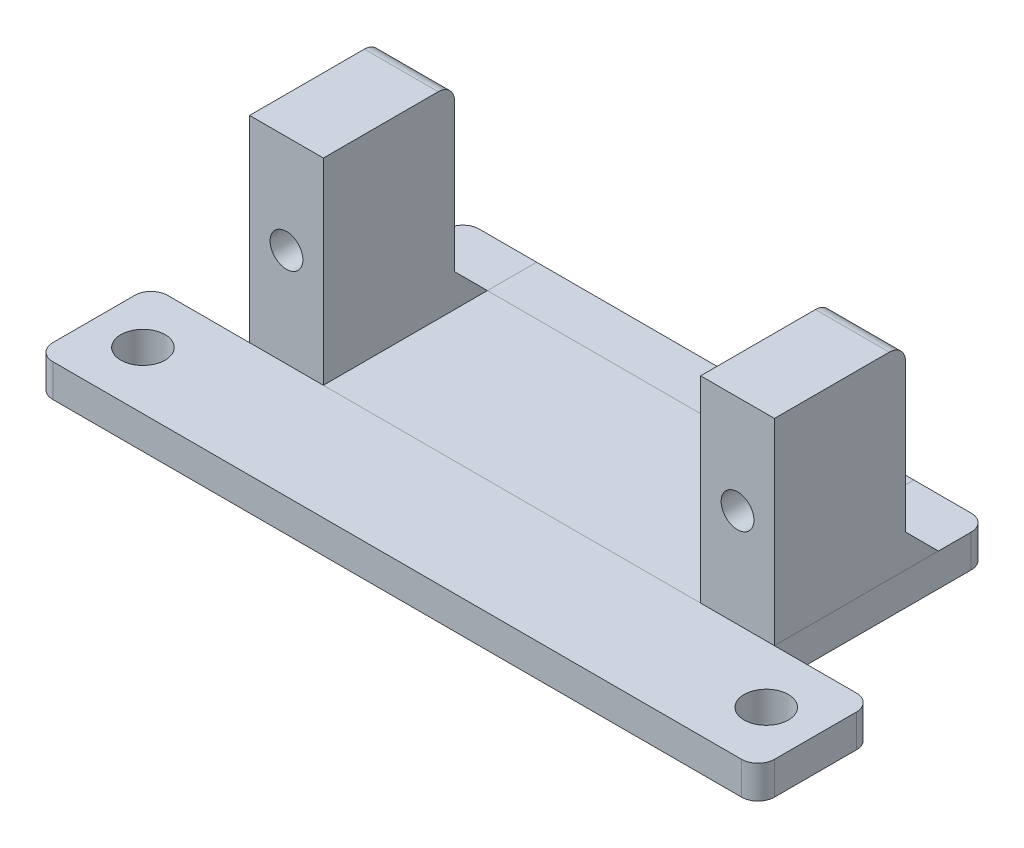
ISO-10303-21;
HEADER;
FILE_DESCRIPTION(('STEP AP214'),'2;1');
FILE_NAME('part.step','',(''),(''),'','','');
FILE_SCHEMA(('AUTOMOTIVE_DESIGN { 1 0 10303 214 1 1 1 1 }'));
ENDSEC;
DATA;
#1=APPLICATION_CONTEXT('core data for automotive mechanical design processes');
#2=APPLICATION_PROTOCOL_DEFINITION('international standard','automotive_design',2000,#1);
#3=PRODUCT_CONTEXT('',#1,'mechanical');
#4=PRODUCT('Part','Part','',(#3));
#5=PRODUCT_RELATED_PRODUCT_CATEGORY('part','',(#4));
#6=PRODUCT_DEFINITION_FORMATION('','',#4);
#7=PRODUCT_DEFINITION_CONTEXT('part definition',#1,'design');
#8=PRODUCT_DEFINITION('design','',#6,#7);
#9=PRODUCT_DEFINITION_SHAPE('','',#8);
#10=(LENGTH_UNIT() NAMED_UNIT(*) SI_UNIT(.MILLI.,.METRE.));
#11=(NAMED_UNIT(*) PLANE_ANGLE_UNIT() SI_UNIT($,.RADIAN.));
#12=(NAMED_UNIT(*) SI_UNIT($,.STERADIAN.) SOLID_ANGLE_UNIT());
#13=UNCERTAINTY_MEASURE_WITH_UNIT(LENGTH_MEASURE(1.E-05),#10,'distance_accuracy_value','');
#14=(GEOMETRIC_REPRESENTATION_CONTEXT(3) GLOBAL_UNCERTAINTY_ASSIGNED_CONTEXT((#13)) GLOBAL_UNIT_ASSIGNED_CONTEXT((#10,
#11,#12)) REPRESENTATION_CONTEXT('',''));
#15=CARTESIAN_POINT('',(0.,0.,0.));
#16=DIRECTION('',(0.,0.,1.));
#17=DIRECTION('',(1.,0.,0.));
#18=AXIS2_PLACEMENT_3D('',#15,#16,#17);
#19=CARTESIAN_POINT('',(-16.,0.,-13.));
#20=DIRECTION('',(-1.,0.,0.));
#21=DIRECTION('',(0.,0.,1.));
#22=AXIS2_PLACEMENT_3D('',#19,#20,#21);
#23=PLANE('',#22);
#24=DIRECTION('',(0.,0.,1.));
#25=VECTOR('',#24,1.);
#26=CARTESIAN_POINT('',(-16.,0.,-13.));
#27=LINE('',#26,#25);
#28=CARTESIAN_POINT('',(-16.,0.,-12.));
#29=VERTEX_POINT('',#28);
#30=CARTESIAN_POINT('',(-16.,0.,-10.));
#31=VERTEX_POINT('',#30);
#32=EDGE_CURVE('E18',#29,#31,#27,.T.);
#33=ORIENTED_EDGE('',*,*,#32,.F.);
#34=DIRECTION('',(0.,-1.,0.));
#35=VECTOR('',#34,1.);
#36=CARTESIAN_POINT('',(-16.,0.,-12.));
#37=LINE('',#36,#35);
#38=CARTESIAN_POINT('',(-16.,-2.,-12.));
#39=VERTEX_POINT('',#38);
#40=EDGE_CURVE('E9',#29,#39,#37,.T.);
#41=ORIENTED_EDGE('',*,*,#40,.T.);
#42=DIRECTION('',(0.,0.,1.));
#43=VECTOR('',#42,1.);
#44=CARTESIAN_POINT('',(-16.,-2.,-13.));
#45=LINE('',#44,#43);
#46=CARTESIAN_POINT('',(-16.,-2.,0.));
#47=VERTEX_POINT('',#46);
#48=EDGE_CURVE('E25',#39,#47,#45,.T.);
#49=ORIENTED_EDGE('',*,*,#48,.T.);
#50=DIRECTION('',(0.,-1.,0.));
#51=VECTOR('',#50,1.);
#52=CARTESIAN_POINT('',(-16.,0.,0.));
#53=LINE('',#52,#51);
#54=CARTESIAN_POINT('',(-16.,0.,0.));
#55=VERTEX_POINT('',#54);
#56=EDGE_CURVE('E409',#55,#47,#53,.T.);
#57=ORIENTED_EDGE('',*,*,#56,.F.);
#58=DIRECTION('',(0.,0.,1.));
#59=VECTOR('',#58,1.);
#60=CARTESIAN_POINT('',(-16.,0.,-13.));
#61=LINE('',#60,#59);
#62=EDGE_CURVE('E441',#31,#55,#61,.T.);
#63=ORIENTED_EDGE('',*,*,#62,.F.);
#64=EDGE_LOOP('',(#33,#41,#49,#57,#63));
#65=FACE_BOUND('',#64,.T.);
#66=ADVANCED_FACE('F14',(#65),#23,.T.);
#67=CARTESIAN_POINT('',(0.,0.,-1.78125));
#68=DIRECTION('',(0.,1.,0.));
#69=DIRECTION('',(0.,0.,-1.));
#70=AXIS2_PLACEMENT_3D('',#67,#68,#69);
#71=PLANE('',#70);
#72=DIRECTION('',(-1.,0.,0.));
#73=VECTOR('',#72,1.);
#74=CARTESIAN_POINT('',(16.,0.,-13.));
#75=LINE('',#74,#73);
#76=CARTESIAN_POINT('',(-11.5,0.,-13.));
#77=VERTEX_POINT('',#76);
#78=CARTESIAN_POINT('',(-15.,0.,-13.));
#79=VERTEX_POINT('',#78);
#80=EDGE_CURVE('E352',#77,#79,#75,.T.);
#81=ORIENTED_EDGE('',*,*,#80,.T.);
#82=CARTESIAN_POINT('',(-15.,0.,-12.));
#83=DIRECTION('',(0.,-1.,0.));
#84=DIRECTION('',(0.,0.,-1.));
#85=AXIS2_PLACEMENT_3D('',#82,#83,#84);
#86=CIRCLE('',#85,1.);
#87=EDGE_CURVE('E502',#29,#79,#86,.T.);
#88=ORIENTED_EDGE('',*,*,#87,.F.);
#89=ORIENTED_EDGE('',*,*,#32,.T.);
#90=DIRECTION('',(1.,0.,0.));
#91=VECTOR('',#90,1.);
#92=CARTESIAN_POINT('',(-16.,0.,-10.));
#93=LINE('',#92,#91);
#94=CARTESIAN_POINT('',(-11.5,0.,-10.));
#95=VERTEX_POINT('',#94);
#96=EDGE_CURVE('E526',#31,#95,#93,.T.);
#97=ORIENTED_EDGE('',*,*,#96,.T.);
#98=DIRECTION('',(0.,0.,-1.));
#99=VECTOR('',#98,1.);
#100=CARTESIAN_POINT('',(-11.5,0.,0.));
#101=LINE('',#100,#99);
#102=EDGE_CURVE('E530',#95,#77,#101,.T.);
#103=ORIENTED_EDGE('',*,*,#102,.T.);
#104=EDGE_LOOP('',(#81,#88,#89,#97,#103));
#105=FACE_BOUND('',#104,.T.);
#106=ADVANCED_FACE('F910',(#105),#71,.T.);
#107=CARTESIAN_POINT('',(-15.,0.,-12.));
#108=DIRECTION('',(0.,-1.,0.));
#109=DIRECTION('',(-1.,0.,0.));
#110=AXIS2_PLACEMENT_3D('',#107,#108,#109);
#111=CYLINDRICAL_SURFACE('',#110,1.);
#112=ORIENTED_EDGE('',*,*,#87,.T.);
#113=DIRECTION('',(0.,-1.,0.));
#114=VECTOR('',#113,1.);
#115=CARTESIAN_POINT('',(-15.,0.,-13.));
#116=LINE('',#115,#114);
#117=CARTESIAN_POINT('',(-15.,-2.,-13.));
#118=VERTEX_POINT('',#117);
#119=EDGE_CURVE('E356',#79,#118,#116,.T.);
#120=ORIENTED_EDGE('',*,*,#119,.T.);
#121=CARTESIAN_POINT('',(-15.,-2.,-12.));
#122=DIRECTION('',(0.,-1.,0.));
#123=DIRECTION('',(0.,0.,-1.));
#124=AXIS2_PLACEMENT_3D('',#121,#122,#123);
#125=CIRCLE('',#124,1.);
#126=EDGE_CURVE('E531',#39,#118,#125,.T.);
#127=ORIENTED_EDGE('',*,*,#126,.F.);
#128=ORIENTED_EDGE('',*,*,#40,.F.);
#129=EDGE_LOOP('',(#112,#120,#127,#128));
#130=FACE_BOUND('',#129,.T.);
#131=ADVANCED_FACE('F981',(#130),#111,.T.);
#132=CARTESIAN_POINT('',(-16.,5.62309763147,-4.37690236853));
#133=DIRECTION('',(-1.,0.,0.));
#134=DIRECTION('',(0.,0.,1.));
#135=AXIS2_PLACEMENT_3D('',#132,#133,#134);
#136=PLANE('',#135);
#137=DIRECTION('',(0.,0.,-1.));
#138=VECTOR('',#137,1.);
#139=CARTESIAN_POINT('',(-16.,12.,0.));
#140=LINE('',#139,#138);
#141=CARTESIAN_POINT('',(-16.,12.,0.));
#142=VERTEX_POINT('',#141);
#143=CARTESIAN_POINT('',(-16.,12.,-7.));
#144=VERTEX_POINT('',#143);
#145=EDGE_CURVE('E353',#142,#144,#140,.T.);
#146=ORIENTED_EDGE('',*,*,#145,.T.);
#147=CARTESIAN_POINT('',(-16.,11.,-7.));
#148=DIRECTION('',(-1.,0.,0.));
#149=DIRECTION('',(0.,0.,1.));
#150=AXIS2_PLACEMENT_3D('',#147,#148,#149);
#151=CIRCLE('',#150,1.);
#152=CARTESIAN_POINT('',(-16.,11.,-8.));
#153=VERTEX_POINT('',#152);
#154=EDGE_CURVE('E202',#144,#153,#151,.T.);
#155=ORIENTED_EDGE('',*,*,#154,.T.);
#156=DIRECTION('',(0.,-1.,0.));
#157=VECTOR('',#156,1.);
#158=CARTESIAN_POINT('',(-16.,12.,-8.));
#159=LINE('',#158,#157);
#160=CARTESIAN_POINT('',(-16.,2.,-8.));
#161=VERTEX_POINT('',#160);
#162=EDGE_CURVE('E217',#153,#161,#159,.T.);
#163=ORIENTED_EDGE('',*,*,#162,.T.);
#164=DIRECTION('',(0.,-0.707106781186548,-0.707106781186548));
#165=VECTOR('',#164,1.);
#166=CARTESIAN_POINT('',(-16.,2.,-8.));
#167=LINE('',#166,#165);
#168=EDGE_CURVE('E437',#161,#31,#167,.T.);
#169=ORIENTED_EDGE('',*,*,#168,.T.);
#170=ORIENTED_EDGE('',*,*,#62,.T.);
#171=DIRECTION('',(0.,1.,0.));
#172=VECTOR('',#171,1.);
#173=CARTESIAN_POINT('',(-16.,0.,0.));
#174=LINE('',#173,#172);
#175=EDGE_CURVE('E315',#55,#142,#174,.T.);
#176=ORIENTED_EDGE('',*,*,#175,.T.);
#177=EDGE_LOOP('',(#146,#155,#163,#169,#170,#176));
#178=FACE_BOUND('',#177,.T.);
#179=ADVANCED_FACE('F896',(#178),#136,.T.);
#180=CARTESIAN_POINT('',(0.,-2.,-1.78125));
#181=DIRECTION('',(0.,1.,0.));
#182=DIRECTION('',(0.,0.,-1.));
#183=AXIS2_PLACEMENT_3D('',#180,#181,#182);
#184=PLANE('',#183);
#185=CARTESIAN_POINT('',(-21.,-2.,6.));
#186=DIRECTION('',(0.,1.,0.));
#187=DIRECTION('',(0.,0.,-1.));
#188=AXIS2_PLACEMENT_3D('',#185,#186,#187);
#189=CIRCLE('',#188,1.);
#190=CARTESIAN_POINT('',(-22.,-2.,6.));
#191=VERTEX_POINT('',#190);
#192=CARTESIAN_POINT('',(-21.,-2.,7.));
#193=VERTEX_POINT('',#192);
#194=EDGE_CURVE('E458',#191,#193,#189,.T.);
#195=ORIENTED_EDGE('',*,*,#194,.F.);
#196=DIRECTION('',(0.,0.,1.));
#197=VECTOR('',#196,1.);
#198=CARTESIAN_POINT('',(-22.,-2.,0.));
#199=LINE('',#198,#197);
#200=CARTESIAN_POINT('',(-22.,-2.,1.));
#201=VERTEX_POINT('',#200);
#202=EDGE_CURVE('E361',#201,#191,#199,.T.);
#203=ORIENTED_EDGE('',*,*,#202,.F.);
#204=CARTESIAN_POINT('',(-21.,-2.,1.));
#205=DIRECTION('',(0.,1.,0.));
#206=DIRECTION('',(0.,0.,-1.));
#207=AXIS2_PLACEMENT_3D('',#204,#205,#206);
#208=CIRCLE('',#207,1.);
#209=CARTESIAN_POINT('',(-21.,-2.,0.));
#210=VERTEX_POINT('',#209);
#211=EDGE_CURVE('E375',#210,#201,#208,.T.);
#212=ORIENTED_EDGE('',*,*,#211,.F.);
#213=DIRECTION('',(-1.,0.,0.));
#214=VECTOR('',#213,1.);
#215=CARTESIAN_POINT('',(-16.,-2.,0.));
#216=LINE('',#215,#214);
#217=EDGE_CURVE('E405',#47,#210,#216,.T.);
#218=ORIENTED_EDGE('',*,*,#217,.F.);
#219=ORIENTED_EDGE('',*,*,#48,.F.);
#220=ORIENTED_EDGE('',*,*,#126,.T.);
#221=DIRECTION('',(-1.,0.,0.));
#222=VECTOR('',#221,1.);
#223=CARTESIAN_POINT('',(16.,-2.,-13.));
#224=LINE('',#223,#222);
#225=CARTESIAN_POINT('',(15.,-2.,-13.));
#226=VERTEX_POINT('',#225);
#227=EDGE_CURVE('E429',#226,#118,#224,.T.);
#228=ORIENTED_EDGE('',*,*,#227,.F.);
#229=CARTESIAN_POINT('',(15.,-2.,-12.));
#230=DIRECTION('',(0.,-1.,0.));
#231=DIRECTION('',(0.,0.,-1.));
#232=AXIS2_PLACEMENT_3D('',#229,#230,#231);
#233=CIRCLE('',#232,1.);
#234=CARTESIAN_POINT('',(16.,-2.,-12.));
#235=VERTEX_POINT('',#234);
#236=EDGE_CURVE('E534',#226,#235,#233,.T.);
#237=ORIENTED_EDGE('',*,*,#236,.T.);
#238=DIRECTION('',(0.,0.,-1.));
#239=VECTOR('',#238,1.);
#240=CARTESIAN_POINT('',(16.,-2.,0.));
#241=LINE('',#240,#239);
#242=CARTESIAN_POINT('',(16.,-2.,0.));
#243=VERTEX_POINT('',#242);
#244=EDGE_CURVE('E80',#243,#235,#241,.T.);
#245=ORIENTED_EDGE('',*,*,#244,.F.);
#246=DIRECTION('',(-1.,0.,0.));
#247=VECTOR('',#246,1.);
#248=CARTESIAN_POINT('',(22.,-2.,0.));
#249=LINE('',#248,#247);
#250=CARTESIAN_POINT('',(21.,-2.,0.));
#251=VERTEX_POINT('',#250);
#252=EDGE_CURVE('E92',#251,#243,#249,.T.);
#253=ORIENTED_EDGE('',*,*,#252,.F.);
#254=CARTESIAN_POINT('',(21.,-2.,1.));
#255=DIRECTION('',(0.,-1.,0.));
#256=DIRECTION('',(0.,0.,-1.));
#257=AXIS2_PLACEMENT_3D('',#254,#255,#256);
#258=CIRCLE('',#257,1.);
#259=CARTESIAN_POINT('',(22.,-2.,1.));
#260=VERTEX_POINT('',#259);
#261=EDGE_CURVE('E549',#251,#260,#258,.T.);
#262=ORIENTED_EDGE('',*,*,#261,.T.);
#263=DIRECTION('',(0.,0.,-1.));
#264=VECTOR('',#263,1.);
#265=CARTESIAN_POINT('',(22.,-2.,7.));
#266=LINE('',#265,#264);
#267=CARTESIAN_POINT('',(22.,-2.,6.));
#268=VERTEX_POINT('',#267);
#269=EDGE_CURVE('E362',#268,#260,#266,.T.);
#270=ORIENTED_EDGE('',*,*,#269,.F.);
#271=CARTESIAN_POINT('',(21.,-2.,6.));
#272=DIRECTION('',(0.,-1.,0.));
#273=DIRECTION('',(0.,0.,-1.));
#274=AXIS2_PLACEMENT_3D('',#271,#272,#273);
#275=CIRCLE('',#274,1.);
#276=CARTESIAN_POINT('',(21.,-2.,7.));
#277=VERTEX_POINT('',#276);
#278=EDGE_CURVE('E552',#268,#277,#275,.T.);
#279=ORIENTED_EDGE('',*,*,#278,.T.);
#280=DIRECTION('',(1.,0.,0.));
#281=VECTOR('',#280,1.);
#282=CARTESIAN_POINT('',(-22.,-2.,7.));
#283=LINE('',#282,#281);
#284=EDGE_CURVE('E545',#193,#277,#283,.T.);
#285=ORIENTED_EDGE('',*,*,#284,.F.);
#286=EDGE_LOOP('',(#195,#203,#212,#218,#219,#220,#228,#237,#245,#253,#262,#270,#279,#285));
#287=FACE_BOUND('',#286,.T.);
#288=CARTESIAN_POINT('',(-19.,-2.,3.5));
#289=DIRECTION('',(0.,-1.,0.));
#290=DIRECTION('',(-1.,0.,0.));
#291=AXIS2_PLACEMENT_3D('',#288,#289,#290);
#292=CIRCLE('',#291,1.35);
#293=CARTESIAN_POINT('',(-20.35,-2.,3.5));
#294=VERTEX_POINT('',#293);
#295=EDGE_CURVE('E389',#294,#294,#292,.T.);
#296=ORIENTED_EDGE('',*,*,#295,.F.);
#297=EDGE_LOOP('',(#296));
#298=FACE_BOUND('',#297,.T.);
#299=CARTESIAN_POINT('',(19.,-2.,3.5));
#300=DIRECTION('',(0.,-1.,0.));
#301=DIRECTION('',(-1.,0.,0.));
#302=AXIS2_PLACEMENT_3D('',#299,#300,#301);
#303=CIRCLE('',#302,1.35);
#304=CARTESIAN_POINT('',(17.65,-2.,3.5));
#305=VERTEX_POINT('',#304);
#306=EDGE_CURVE('E448',#305,#305,#303,.T.);
#307=ORIENTED_EDGE('',*,*,#306,.F.);
#308=EDGE_LOOP('',(#307));
#309=FACE_BOUND('',#308,.T.);
#310=ADVANCED_FACE('F1021',(#287,#298,#309),#184,.F.);
#311=CARTESIAN_POINT('',(-16.,0.,0.));
#312=DIRECTION('',(0.,0.,-1.));
#313=DIRECTION('',(0.,-1.,0.));
#314=AXIS2_PLACEMENT_3D('',#311,#312,#313);
#315=PLANE('',#314);
#316=DIRECTION('',(-1.,0.,0.));
#317=VECTOR('',#316,1.);
#318=CARTESIAN_POINT('',(-16.,0.,0.));
#319=LINE('',#318,#317);
#320=CARTESIAN_POINT('',(-21.,0.,0.));
#321=VERTEX_POINT('',#320);
#322=EDGE_CURVE('E295',#55,#321,#319,.T.);
#323=ORIENTED_EDGE('',*,*,#322,.F.);
#324=ORIENTED_EDGE('',*,*,#56,.T.);
#325=ORIENTED_EDGE('',*,*,#217,.T.);
#326=DIRECTION('',(0.,-1.,0.));
#327=VECTOR('',#326,1.);
#328=CARTESIAN_POINT('',(-21.,0.,0.));
#329=LINE('',#328,#327);
#330=EDGE_CURVE('E378',#321,#210,#329,.T.);
#331=ORIENTED_EDGE('',*,*,#330,.F.);
#332=EDGE_LOOP('',(#323,#324,#325,#331));
#333=FACE_BOUND('',#332,.T.);
#334=ADVANCED_FACE('F1046',(#333),#315,.T.);
#335=CARTESIAN_POINT('',(16.,0.,-13.));
#336=DIRECTION('',(0.,0.,-1.));
#337=DIRECTION('',(0.,-1.,0.));
#338=AXIS2_PLACEMENT_3D('',#335,#336,#337);
#339=PLANE('',#338);
#340=DIRECTION('',(-1.,0.,0.));
#341=VECTOR('',#340,1.);
#342=CARTESIAN_POINT('',(16.,0.,-13.));
#343=LINE('',#342,#341);
#344=CARTESIAN_POINT('',(15.,0.,-13.));
#345=VERTEX_POINT('',#344);
#346=CARTESIAN_POINT('',(11.5,0.,-13.));
#347=VERTEX_POINT('',#346);
#348=EDGE_CURVE('E380',#345,#347,#343,.T.);
#349=ORIENTED_EDGE('',*,*,#348,.F.);
#350=DIRECTION('',(0.,-1.,0.));
#351=VECTOR('',#350,1.);
#352=CARTESIAN_POINT('',(15.,0.,-13.));
#353=LINE('',#352,#351);
#354=EDGE_CURVE('E410',#345,#226,#353,.T.);
#355=ORIENTED_EDGE('',*,*,#354,.T.);
#356=ORIENTED_EDGE('',*,*,#227,.T.);
#357=ORIENTED_EDGE('',*,*,#119,.F.);
#358=ORIENTED_EDGE('',*,*,#80,.F.);
#359=DIRECTION('',(-1.,0.,0.));
#360=VECTOR('',#359,1.);
#361=CARTESIAN_POINT('',(16.,0.,-13.));
#362=LINE('',#361,#360);
#363=EDGE_CURVE('E373',#347,#77,#362,.T.);
#364=ORIENTED_EDGE('',*,*,#363,.F.);
#365=EDGE_LOOP('',(#349,#355,#356,#357,#358,#364));
#366=FACE_BOUND('',#365,.T.);
#367=ADVANCED_FACE('F1062',(#366),#339,.T.);
#368=CARTESIAN_POINT('',(0.,0.,-1.78125));
#369=DIRECTION('',(0.,1.,0.));
#370=DIRECTION('',(0.,0.,-1.));
#371=AXIS2_PLACEMENT_3D('',#368,#369,#370);
#372=PLANE('',#371);
#373=ORIENTED_EDGE('',*,*,#363,.T.);
#374=ORIENTED_EDGE('',*,*,#102,.F.);
#375=DIRECTION('',(1.,0.,0.));
#376=VECTOR('',#375,1.);
#377=CARTESIAN_POINT('',(-16.,0.,-10.));
#378=LINE('',#377,#376);
#379=CARTESIAN_POINT('',(11.5,0.,-10.));
#380=VERTEX_POINT('',#379);
#381=EDGE_CURVE('E323',#95,#380,#378,.T.);
#382=ORIENTED_EDGE('',*,*,#381,.T.);
#383=DIRECTION('',(0.,0.,-1.));
#384=VECTOR('',#383,1.);
#385=CARTESIAN_POINT('',(11.5,0.,0.));
#386=LINE('',#385,#384);
#387=EDGE_CURVE('E374',#380,#347,#386,.T.);
#388=ORIENTED_EDGE('',*,*,#387,.T.);
#389=EDGE_LOOP('',(#373,#374,#382,#388));
#390=FACE_BOUND('',#389,.T.);
#391=ADVANCED_FACE('F1059',(#390),#372,.T.);
#392=CARTESIAN_POINT('',(-16.,2.,-8.));
#393=DIRECTION('',(0.,0.707106781186548,-0.707106781186548));
#394=DIRECTION('',(-1.,0.,0.));
#395=AXIS2_PLACEMENT_3D('',#392,#393,#394);
#396=PLANE('',#395);
#397=ORIENTED_EDGE('',*,*,#168,.F.);
#398=DIRECTION('',(1.,0.,0.));
#399=VECTOR('',#398,1.);
#400=CARTESIAN_POINT('',(-16.,2.,-8.));
#401=LINE('',#400,#399);
#402=CARTESIAN_POINT('',(-11.5,2.,-8.));
#403=VERTEX_POINT('',#402);
#404=EDGE_CURVE('E424',#161,#403,#401,.T.);
#405=ORIENTED_EDGE('',*,*,#404,.T.);
#406=DIRECTION('',(0.,-0.707106781186548,-0.707106781186548));
#407=VECTOR('',#406,1.);
#408=CARTESIAN_POINT('',(-11.5,3.5,-6.5));
#409=LINE('',#408,#407);
#410=EDGE_CURVE('E421',#403,#95,#409,.T.);
#411=ORIENTED_EDGE('',*,*,#410,.T.);
#412=ORIENTED_EDGE('',*,*,#96,.F.);
#413=EDGE_LOOP('',(#397,#405,#411,#412));
#414=FACE_BOUND('',#413,.T.);
#415=ADVANCED_FACE('F906',(#414),#396,.T.);
#416=CARTESIAN_POINT('',(-16.,12.,0.));
#417=DIRECTION('',(0.,1.,0.));
#418=DIRECTION('',(0.,0.,-1.));
#419=AXIS2_PLACEMENT_3D('',#416,#417,#418);
#420=PLANE('',#419);
#421=ORIENTED_EDGE('',*,*,#145,.F.);
#422=DIRECTION('',(1.,0.,0.));
#423=VECTOR('',#422,1.);
#424=CARTESIAN_POINT('',(-16.,12.,0.));
#425=LINE('',#424,#423);
#426=CARTESIAN_POINT('',(-11.5,12.,0.));
#427=VERTEX_POINT('',#426);
#428=EDGE_CURVE('E425',#142,#427,#425,.T.);
#429=ORIENTED_EDGE('',*,*,#428,.T.);
#430=DIRECTION('',(0.,0.,-1.));
#431=VECTOR('',#430,1.);
#432=CARTESIAN_POINT('',(-11.5,12.,0.));
#433=LINE('',#432,#431);
#434=CARTESIAN_POINT('',(-11.5,12.,-7.));
#435=VERTEX_POINT('',#434);
#436=EDGE_CURVE('E305',#427,#435,#433,.T.);
#437=ORIENTED_EDGE('',*,*,#436,.T.);
#438=DIRECTION('',(1.,0.,0.));
#439=VECTOR('',#438,1.);
#440=CARTESIAN_POINT('',(-16.,12.,-7.));
#441=LINE('',#440,#439);
#442=EDGE_CURVE('E397',#144,#435,#441,.T.);
#443=ORIENTED_EDGE('',*,*,#442,.F.);
#444=EDGE_LOOP('',(#421,#429,#437,#443));
#445=FACE_BOUND('',#444,.T.);
#446=ADVANCED_FACE('F899',(#445),#420,.T.);
#447=CARTESIAN_POINT('',(-16.,11.,-7.));
#448=DIRECTION('',(1.,0.,0.));
#449=DIRECTION('',(0.,1.,0.));
#450=AXIS2_PLACEMENT_3D('',#447,#448,#449);
#451=CYLINDRICAL_SURFACE('',#450,1.);
#452=ORIENTED_EDGE('',*,*,#442,.T.);
#453=CARTESIAN_POINT('',(-11.5,11.,-7.));
#454=DIRECTION('',(-1.,0.,0.));
#455=DIRECTION('',(0.,0.,1.));
#456=AXIS2_PLACEMENT_3D('',#453,#454,#455);
#457=CIRCLE('',#456,1.);
#458=CARTESIAN_POINT('',(-11.5,11.,-8.));
#459=VERTEX_POINT('',#458);
#460=EDGE_CURVE('E318',#435,#459,#457,.T.);
#461=ORIENTED_EDGE('',*,*,#460,.T.);
#462=DIRECTION('',(1.,0.,0.));
#463=VECTOR('',#462,1.);
#464=CARTESIAN_POINT('',(-16.,11.,-8.));
#465=LINE('',#464,#463);
#466=EDGE_CURVE('E310',#153,#459,#465,.T.);
#467=ORIENTED_EDGE('',*,*,#466,.F.);
#468=ORIENTED_EDGE('',*,*,#154,.F.);
#469=EDGE_LOOP('',(#452,#461,#467,#468));
#470=FACE_BOUND('',#469,.T.);
#471=ADVANCED_FACE('F900',(#470),#451,.T.);
#472=CARTESIAN_POINT('',(-16.,0.,0.));
#473=DIRECTION('',(0.,0.,1.));
#474=DIRECTION('',(0.,-1.,0.));
#475=AXIS2_PLACEMENT_3D('',#472,#473,#474);
#476=PLANE('',#475);
#477=ORIENTED_EDGE('',*,*,#175,.F.);
#478=DIRECTION('',(1.,0.,0.));
#479=VECTOR('',#478,1.);
#480=CARTESIAN_POINT('',(-16.,0.,0.));
#481=LINE('',#480,#479);
#482=CARTESIAN_POINT('',(-11.5,0.,0.));
#483=VERTEX_POINT('',#482);
#484=EDGE_CURVE('E286',#55,#483,#481,.T.);
#485=ORIENTED_EDGE('',*,*,#484,.T.);
#486=DIRECTION('',(0.,1.,0.));
#487=VECTOR('',#486,1.);
#488=CARTESIAN_POINT('',(-11.5,0.,0.));
#489=LINE('',#488,#487);
#490=EDGE_CURVE('E300',#483,#427,#489,.T.);
#491=ORIENTED_EDGE('',*,*,#490,.T.);
#492=ORIENTED_EDGE('',*,*,#428,.F.);
#493=EDGE_LOOP('',(#477,#485,#491,#492));
#494=FACE_BOUND('',#493,.T.);
#495=CARTESIAN_POINT('',(-13.75,6.,0.));
#496=DIRECTION('',(0.,0.,1.));
#497=DIRECTION('',(1.,0.,0.));
#498=AXIS2_PLACEMENT_3D('',#495,#496,#497);
#499=CIRCLE('',#498,1.);
#500=CARTESIAN_POINT('',(-12.75,6.,0.));
#501=VERTEX_POINT('',#500);
#502=EDGE_CURVE('E337',#501,#501,#499,.T.);
#503=ORIENTED_EDGE('',*,*,#502,.F.);
#504=EDGE_LOOP('',(#503));
#505=FACE_BOUND('',#504,.T.);
#506=ADVANCED_FACE('F313',(#494,#505),#476,.T.);
#507=CARTESIAN_POINT('',(-16.,12.,-8.));
#508=DIRECTION('',(0.,0.,-1.));
#509=DIRECTION('',(0.,-1.,0.));
#510=AXIS2_PLACEMENT_3D('',#507,#508,#509);
#511=PLANE('',#510);
#512=ORIENTED_EDGE('',*,*,#162,.F.);
#513=ORIENTED_EDGE('',*,*,#466,.T.);
#514=DIRECTION('',(0.,-1.,0.));
#515=VECTOR('',#514,1.);
#516=CARTESIAN_POINT('',(-11.5,6.,-8.));
#517=LINE('',#516,#515);
#518=EDGE_CURVE('E492',#459,#403,#517,.T.);
#519=ORIENTED_EDGE('',*,*,#518,.T.);
#520=ORIENTED_EDGE('',*,*,#404,.F.);
#521=EDGE_LOOP('',(#512,#513,#519,#520));
#522=FACE_BOUND('',#521,.T.);
#523=CARTESIAN_POINT('',(-13.75,6.,-8.));
#524=DIRECTION('',(0.,0.,1.));
#525=DIRECTION('',(1.,0.,0.));
#526=AXIS2_PLACEMENT_3D('',#523,#524,#525);
#527=CIRCLE('',#526,1.);
#528=CARTESIAN_POINT('',(-12.75,6.,-8.));
#529=VERTEX_POINT('',#528);
#530=EDGE_CURVE('E488',#529,#529,#527,.T.);
#531=ORIENTED_EDGE('',*,*,#530,.T.);
#532=EDGE_LOOP('',(#531));
#533=FACE_BOUND('',#532,.T.);
#534=ADVANCED_FACE('F903',(#522,#533),#511,.T.);
#535=CARTESIAN_POINT('',(-22.,0.,7.));
#536=DIRECTION('',(0.,0.,1.));
#537=DIRECTION('',(0.,-1.,0.));
#538=AXIS2_PLACEMENT_3D('',#535,#536,#537);
#539=PLANE('',#538);
#540=DIRECTION('',(1.,0.,0.));
#541=VECTOR('',#540,1.);
#542=CARTESIAN_POINT('',(-22.,0.,7.));
#543=LINE('',#542,#541);
#544=CARTESIAN_POINT('',(-21.,0.,7.));
#545=VERTEX_POINT('',#544);
#546=CARTESIAN_POINT('',(21.,0.,7.));
#547=VERTEX_POINT('',#546);
#548=EDGE_CURVE('E348',#545,#547,#543,.T.);
#549=ORIENTED_EDGE('',*,*,#548,.F.);
#550=DIRECTION('',(0.,-1.,0.));
#551=VECTOR('',#550,1.);
#552=CARTESIAN_POINT('',(-21.,0.,7.));
#553=LINE('',#552,#551);
#554=EDGE_CURVE('E493',#545,#193,#553,.T.);
#555=ORIENTED_EDGE('',*,*,#554,.T.);
#556=ORIENTED_EDGE('',*,*,#284,.T.);
#557=DIRECTION('',(0.,-1.,0.));
#558=VECTOR('',#557,1.);
#559=CARTESIAN_POINT('',(21.,0.,7.));
#560=LINE('',#559,#558);
#561=EDGE_CURVE('E487',#547,#277,#560,.T.);
#562=ORIENTED_EDGE('',*,*,#561,.F.);
#563=EDGE_LOOP('',(#549,#555,#556,#562));
#564=FACE_BOUND('',#563,.T.);
#565=ADVANCED_FACE('F1067',(#564),#539,.T.);
#566=CARTESIAN_POINT('',(-21.,0.,6.));
#567=DIRECTION('',(0.,-1.,0.));
#568=DIRECTION('',(-1.,0.,0.));
#569=AXIS2_PLACEMENT_3D('',#566,#567,#568);
#570=CYLINDRICAL_SURFACE('',#569,1.);
#571=DIRECTION('',(0.,-1.,0.));
#572=VECTOR('',#571,1.);
#573=CARTESIAN_POINT('',(-22.,0.,6.));
#574=LINE('',#573,#572);
#575=CARTESIAN_POINT('',(-22.,0.,6.));
#576=VERTEX_POINT('',#575);
#577=EDGE_CURVE('E461',#576,#191,#574,.T.);
#578=ORIENTED_EDGE('',*,*,#577,.T.);
#579=ORIENTED_EDGE('',*,*,#194,.T.);
#580=ORIENTED_EDGE('',*,*,#554,.F.);
#581=CARTESIAN_POINT('',(-21.,0.,6.));
#582=DIRECTION('',(0.,1.,0.));
#583=DIRECTION('',(0.,0.,-1.));
#584=AXIS2_PLACEMENT_3D('',#581,#582,#583);
#585=CIRCLE('',#584,1.);
#586=EDGE_CURVE('E343',#576,#545,#585,.T.);
#587=ORIENTED_EDGE('',*,*,#586,.F.);
#588=EDGE_LOOP('',(#578,#579,#580,#587));
#589=FACE_BOUND('',#588,.T.);
#590=ADVANCED_FACE('F1064',(#589),#570,.T.);
#591=CARTESIAN_POINT('',(21.,0.,6.));
#592=DIRECTION('',(0.,-1.,0.));
#593=DIRECTION('',(1.,0.,0.));
#594=AXIS2_PLACEMENT_3D('',#591,#592,#593);
#595=CYLINDRICAL_SURFACE('',#594,1.);
#596=CARTESIAN_POINT('',(21.,0.,6.));
#597=DIRECTION('',(0.,-1.,0.));
#598=DIRECTION('',(0.,0.,-1.));
#599=AXIS2_PLACEMENT_3D('',#596,#597,#598);
#600=CIRCLE('',#599,1.);
#601=CARTESIAN_POINT('',(22.,0.,6.));
#602=VERTEX_POINT('',#601);
#603=EDGE_CURVE('E462',#602,#547,#600,.T.);
#604=ORIENTED_EDGE('',*,*,#603,.T.);
#605=ORIENTED_EDGE('',*,*,#561,.T.);
#606=ORIENTED_EDGE('',*,*,#278,.F.);
#607=DIRECTION('',(0.,-1.,0.));
#608=VECTOR('',#607,1.);
#609=CARTESIAN_POINT('',(22.,0.,6.));
#610=LINE('',#609,#608);
#611=EDGE_CURVE('E357',#602,#268,#610,.T.);
#612=ORIENTED_EDGE('',*,*,#611,.F.);
#613=EDGE_LOOP('',(#604,#605,#606,#612));
#614=FACE_BOUND('',#613,.T.);
#615=ADVANCED_FACE('F1027',(#614),#595,.T.);
#616=CARTESIAN_POINT('',(-22.,0.,0.));
#617=DIRECTION('',(-1.,0.,0.));
#618=DIRECTION('',(0.,0.,1.));
#619=AXIS2_PLACEMENT_3D('',#616,#617,#618);
#620=PLANE('',#619);
#621=DIRECTION('',(0.,0.,1.));
#622=VECTOR('',#621,1.);
#623=CARTESIAN_POINT('',(-22.,0.,0.));
#624=LINE('',#623,#622);
#625=CARTESIAN_POINT('',(-22.,0.,1.));
#626=VERTEX_POINT('',#625);
#627=EDGE_CURVE('E347',#626,#576,#624,.T.);
#628=ORIENTED_EDGE('',*,*,#627,.F.);
#629=DIRECTION('',(0.,-1.,0.));
#630=VECTOR('',#629,1.);
#631=CARTESIAN_POINT('',(-22.,0.,1.));
#632=LINE('',#631,#630);
#633=EDGE_CURVE('E516',#626,#201,#632,.T.);
#634=ORIENTED_EDGE('',*,*,#633,.T.);
#635=ORIENTED_EDGE('',*,*,#202,.T.);
#636=ORIENTED_EDGE('',*,*,#577,.F.);
#637=EDGE_LOOP('',(#628,#634,#635,#636));
#638=FACE_BOUND('',#637,.T.);
#639=ADVANCED_FACE('F1031',(#638),#620,.T.);
#640=CARTESIAN_POINT('',(22.,0.,7.));
#641=DIRECTION('',(1.,0.,0.));
#642=DIRECTION('',(0.,1.,0.));
#643=AXIS2_PLACEMENT_3D('',#640,#641,#642);
#644=PLANE('',#643);
#645=DIRECTION('',(0.,0.,-1.));
#646=VECTOR('',#645,1.);
#647=CARTESIAN_POINT('',(22.,0.,7.));
#648=LINE('',#647,#646);
#649=CARTESIAN_POINT('',(22.,0.,1.));
#650=VERTEX_POINT('',#649);
#651=EDGE_CURVE('E368',#602,#650,#648,.T.);
#652=ORIENTED_EDGE('',*,*,#651,.F.);
#653=ORIENTED_EDGE('',*,*,#611,.T.);
#654=ORIENTED_EDGE('',*,*,#269,.T.);
#655=DIRECTION('',(0.,-1.,0.));
#656=VECTOR('',#655,1.);
#657=CARTESIAN_POINT('',(22.,0.,1.));
#658=LINE('',#657,#656);
#659=EDGE_CURVE('E473',#650,#260,#658,.T.);
#660=ORIENTED_EDGE('',*,*,#659,.F.);
#661=EDGE_LOOP('',(#652,#653,#654,#660));
#662=FACE_BOUND('',#661,.T.);
#663=ADVANCED_FACE('F1029',(#662),#644,.T.);
#664=CARTESIAN_POINT('',(-21.,0.,1.));
#665=DIRECTION('',(0.,-1.,0.));
#666=DIRECTION('',(0.,0.,-1.));
#667=AXIS2_PLACEMENT_3D('',#664,#665,#666);
#668=CYLINDRICAL_SURFACE('',#667,1.);
#669=ORIENTED_EDGE('',*,*,#330,.T.);
#670=ORIENTED_EDGE('',*,*,#211,.T.);
#671=ORIENTED_EDGE('',*,*,#633,.F.);
#672=CARTESIAN_POINT('',(-21.,0.,1.));
#673=DIRECTION('',(0.,1.,0.));
#674=DIRECTION('',(0.,0.,-1.));
#675=AXIS2_PLACEMENT_3D('',#672,#673,#674);
#676=CIRCLE('',#675,1.);
#677=EDGE_CURVE('E383',#321,#626,#676,.T.);
#678=ORIENTED_EDGE('',*,*,#677,.F.);
#679=EDGE_LOOP('',(#669,#670,#671,#678));
#680=FACE_BOUND('',#679,.T.);
#681=ADVANCED_FACE('F1011',(#680),#668,.T.);
#682=CARTESIAN_POINT('',(21.,0.,1.));
#683=DIRECTION('',(0.,-1.,0.));
#684=DIRECTION('',(0.,0.,-1.));
#685=AXIS2_PLACEMENT_3D('',#682,#683,#684);
#686=CYLINDRICAL_SURFACE('',#685,1.);
#687=CARTESIAN_POINT('',(21.,0.,1.));
#688=DIRECTION('',(0.,-1.,0.));
#689=DIRECTION('',(0.,0.,-1.));
#690=AXIS2_PLACEMENT_3D('',#687,#688,#689);
#691=CIRCLE('',#690,1.);
#692=CARTESIAN_POINT('',(21.,0.,0.));
#693=VERTEX_POINT('',#692);
#694=EDGE_CURVE('E379',#693,#650,#691,.T.);
#695=ORIENTED_EDGE('',*,*,#694,.T.);
#696=ORIENTED_EDGE('',*,*,#659,.T.);
#697=ORIENTED_EDGE('',*,*,#261,.F.);
#698=DIRECTION('',(0.,-1.,0.));
#699=VECTOR('',#698,1.);
#700=CARTESIAN_POINT('',(21.,0.,0.));
#701=LINE('',#700,#699);
#702=EDGE_CURVE('E609',#693,#251,#701,.T.);
#703=ORIENTED_EDGE('',*,*,#702,.F.);
#704=EDGE_LOOP('',(#695,#696,#697,#703));
#705=FACE_BOUND('',#704,.T.);
#706=ADVANCED_FACE('F1006',(#705),#686,.T.);
#707=CARTESIAN_POINT('',(22.,0.,0.));
#708=DIRECTION('',(0.,0.,-1.));
#709=DIRECTION('',(0.,-1.,0.));
#710=AXIS2_PLACEMENT_3D('',#707,#708,#709);
#711=PLANE('',#710);
#712=DIRECTION('',(-1.,0.,0.));
#713=VECTOR('',#712,1.);
#714=CARTESIAN_POINT('',(22.,0.,0.));
#715=LINE('',#714,#713);
#716=CARTESIAN_POINT('',(16.,0.,0.));
#717=VERTEX_POINT('',#716);
#718=EDGE_CURVE('E294',#693,#717,#715,.T.);
#719=ORIENTED_EDGE('',*,*,#718,.F.);
#720=ORIENTED_EDGE('',*,*,#702,.T.);
#721=ORIENTED_EDGE('',*,*,#252,.T.);
#722=DIRECTION('',(0.,-1.,0.));
#723=VECTOR('',#722,1.);
#724=CARTESIAN_POINT('',(16.,0.,0.));
#725=LINE('',#724,#723);
#726=EDGE_CURVE('E503',#717,#243,#725,.T.);
#727=ORIENTED_EDGE('',*,*,#726,.F.);
#728=EDGE_LOOP('',(#719,#720,#721,#727));
#729=FACE_BOUND('',#728,.T.);
#730=ADVANCED_FACE('F991',(#729),#711,.T.);
#731=CARTESIAN_POINT('',(16.,0.,0.));
#732=DIRECTION('',(1.,0.,0.));
#733=DIRECTION('',(0.,1.,0.));
#734=AXIS2_PLACEMENT_3D('',#731,#732,#733);
#735=PLANE('',#734);
#736=DIRECTION('',(0.,0.,-1.));
#737=VECTOR('',#736,1.);
#738=CARTESIAN_POINT('',(16.,0.,0.));
#739=LINE('',#738,#737);
#740=CARTESIAN_POINT('',(16.,0.,-10.));
#741=VERTEX_POINT('',#740);
#742=CARTESIAN_POINT('',(16.,0.,-12.));
#743=VERTEX_POINT('',#742);
#744=EDGE_CURVE('E334',#741,#743,#739,.T.);
#745=ORIENTED_EDGE('',*,*,#744,.F.);
#746=DIRECTION('',(0.,0.,-1.));
#747=VECTOR('',#746,1.);
#748=CARTESIAN_POINT('',(16.,0.,0.));
#749=LINE('',#748,#747);
#750=EDGE_CURVE('E523',#717,#741,#749,.T.);
#751=ORIENTED_EDGE('',*,*,#750,.F.);
#752=ORIENTED_EDGE('',*,*,#726,.T.);
#753=ORIENTED_EDGE('',*,*,#244,.T.);
#754=DIRECTION('',(0.,-1.,0.));
#755=VECTOR('',#754,1.);
#756=CARTESIAN_POINT('',(16.,0.,-12.));
#757=LINE('',#756,#755);
#758=EDGE_CURVE('E367',#743,#235,#757,.T.);
#759=ORIENTED_EDGE('',*,*,#758,.F.);
#760=EDGE_LOOP('',(#745,#751,#752,#753,#759));
#761=FACE_BOUND('',#760,.T.);
#762=ADVANCED_FACE('F632',(#761),#735,.T.);
#763=CARTESIAN_POINT('',(15.,0.,-12.));
#764=DIRECTION('',(0.,-1.,0.));
#765=DIRECTION('',(0.,0.,-1.));
#766=AXIS2_PLACEMENT_3D('',#763,#764,#765);
#767=CYLINDRICAL_SURFACE('',#766,1.);
#768=CARTESIAN_POINT('',(15.,0.,-12.));
#769=DIRECTION('',(0.,-1.,0.));
#770=DIRECTION('',(0.,0.,-1.));
#771=AXIS2_PLACEMENT_3D('',#768,#769,#770);
#772=CIRCLE('',#771,1.);
#773=EDGE_CURVE('E363',#345,#743,#772,.T.);
#774=ORIENTED_EDGE('',*,*,#773,.T.);
#775=ORIENTED_EDGE('',*,*,#758,.T.);
#776=ORIENTED_EDGE('',*,*,#236,.F.);
#777=ORIENTED_EDGE('',*,*,#354,.F.);
#778=EDGE_LOOP('',(#774,#775,#776,#777));
#779=FACE_BOUND('',#778,.T.);
#780=ADVANCED_FACE('F990',(#779),#767,.T.);
#781=CARTESIAN_POINT('',(-19.,0.,3.5));
#782=DIRECTION('',(0.,-1.,0.));
#783=DIRECTION('',(-1.,0.,0.));
#784=AXIS2_PLACEMENT_3D('',#781,#782,#783);
#785=CYLINDRICAL_SURFACE('',#784,1.35);
#786=DIRECTION('',(0.,-1.,0.));
#787=VECTOR('',#786,1.);
#788=CARTESIAN_POINT('',(-20.35,0.,3.5));
#789=LINE('',#788,#787);
#790=CARTESIAN_POINT('',(-20.35,0.,3.5));
#791=VERTEX_POINT('',#790);
#792=EDGE_CURVE('E436',#791,#294,#789,.T.);
#793=ORIENTED_EDGE('',*,*,#792,.F.);
#794=CARTESIAN_POINT('',(-19.,0.,3.5));
#795=DIRECTION('',(0.,1.,0.));
#796=DIRECTION('',(-1.,0.,0.));
#797=AXIS2_PLACEMENT_3D('',#794,#795,#796);
#798=CIRCLE('',#797,1.35);
#799=EDGE_CURVE('E432',#791,#791,#798,.T.);
#800=ORIENTED_EDGE('',*,*,#799,.T.);
#801=ORIENTED_EDGE('',*,*,#792,.T.);
#802=ORIENTED_EDGE('',*,*,#295,.T.);
#803=EDGE_LOOP('',(#793,#800,#801,#802));
#804=FACE_BOUND('',#803,.T.);
#805=ADVANCED_FACE('F1003',(#804),#785,.F.);
#806=CARTESIAN_POINT('',(19.,0.,3.5));
#807=DIRECTION('',(0.,-1.,0.));
#808=DIRECTION('',(-1.,0.,0.));
#809=AXIS2_PLACEMENT_3D('',#806,#807,#808);
#810=CYLINDRICAL_SURFACE('',#809,1.35);
#811=DIRECTION('',(0.,-1.,0.));
#812=VECTOR('',#811,1.);
#813=CARTESIAN_POINT('',(17.65,0.,3.5));
#814=LINE('',#813,#812);
#815=CARTESIAN_POINT('',(17.65,0.,3.5));
#816=VERTEX_POINT('',#815);
#817=EDGE_CURVE('E390',#816,#305,#814,.T.);
#818=ORIENTED_EDGE('',*,*,#817,.F.);
#819=CARTESIAN_POINT('',(19.,0.,3.5));
#820=DIRECTION('',(0.,1.,0.));
#821=DIRECTION('',(-1.,0.,0.));
#822=AXIS2_PLACEMENT_3D('',#819,#820,#821);
#823=CIRCLE('',#822,1.35);
#824=EDGE_CURVE('E385',#816,#816,#823,.T.);
#825=ORIENTED_EDGE('',*,*,#824,.T.);
#826=ORIENTED_EDGE('',*,*,#817,.T.);
#827=ORIENTED_EDGE('',*,*,#306,.T.);
#828=EDGE_LOOP('',(#818,#825,#826,#827));
#829=FACE_BOUND('',#828,.T.);
#830=ADVANCED_FACE('F1055',(#829),#810,.F.);
#831=CARTESIAN_POINT('',(0.,0.,-1.78125));
#832=DIRECTION('',(0.,1.,0.));
#833=DIRECTION('',(0.,0.,-1.));
#834=AXIS2_PLACEMENT_3D('',#831,#832,#833);
#835=PLANE('',#834);
#836=ORIENTED_EDGE('',*,*,#627,.T.);
#837=ORIENTED_EDGE('',*,*,#586,.T.);
#838=ORIENTED_EDGE('',*,*,#548,.T.);
#839=ORIENTED_EDGE('',*,*,#603,.F.);
#840=ORIENTED_EDGE('',*,*,#651,.T.);
#841=ORIENTED_EDGE('',*,*,#694,.F.);
#842=ORIENTED_EDGE('',*,*,#718,.T.);
#843=DIRECTION('',(1.,0.,0.));
#844=VECTOR('',#843,1.);
#845=CARTESIAN_POINT('',(-16.,0.,0.));
#846=LINE('',#845,#844);
#847=CARTESIAN_POINT('',(11.5,0.,0.));
#848=VERTEX_POINT('',#847);
#849=EDGE_CURVE('E288',#848,#717,#846,.T.);
#850=ORIENTED_EDGE('',*,*,#849,.F.);
#851=DIRECTION('',(-1.,0.,0.));
#852=VECTOR('',#851,1.);
#853=CARTESIAN_POINT('',(11.5,0.,0.));
#854=LINE('',#853,#852);
#855=EDGE_CURVE('E280',#848,#483,#854,.T.);
#856=ORIENTED_EDGE('',*,*,#855,.T.);
#857=ORIENTED_EDGE('',*,*,#484,.F.);
#858=ORIENTED_EDGE('',*,*,#322,.T.);
#859=ORIENTED_EDGE('',*,*,#677,.T.);
#860=EDGE_LOOP('',(#836,#837,#838,#839,#840,#841,#842,#850,#856,#857,#858,#859));
#861=FACE_BOUND('',#860,.T.);
#862=ORIENTED_EDGE('',*,*,#799,.F.);
#863=EDGE_LOOP('',(#862));
#864=FACE_BOUND('',#863,.T.);
#865=ORIENTED_EDGE('',*,*,#824,.F.);
#866=EDGE_LOOP('',(#865));
#867=FACE_BOUND('',#866,.T.);
#868=ADVANCED_FACE('F283',(#861,#864,#867),#835,.T.);
#869=CARTESIAN_POINT('',(0.,0.,-1.78125));
#870=DIRECTION('',(0.,1.,0.));
#871=DIRECTION('',(0.,0.,-1.));
#872=AXIS2_PLACEMENT_3D('',#869,#870,#871);
#873=PLANE('',#872);
#874=ORIENTED_EDGE('',*,*,#348,.T.);
#875=ORIENTED_EDGE('',*,*,#387,.F.);
#876=DIRECTION('',(1.,0.,0.));
#877=VECTOR('',#876,1.);
#878=CARTESIAN_POINT('',(-16.,0.,-10.));
#879=LINE('',#878,#877);
#880=EDGE_CURVE('E384',#380,#741,#879,.T.);
#881=ORIENTED_EDGE('',*,*,#880,.T.);
#882=ORIENTED_EDGE('',*,*,#744,.T.);
#883=ORIENTED_EDGE('',*,*,#773,.F.);
#884=EDGE_LOOP('',(#874,#875,#881,#882,#883));
#885=FACE_BOUND('',#884,.T.);
#886=ADVANCED_FACE('F638',(#885),#873,.T.);
#887=CARTESIAN_POINT('',(11.5,0.,0.));
#888=DIRECTION('',(0.,1.,0.));
#889=DIRECTION('',(0.,0.,-1.));
#890=AXIS2_PLACEMENT_3D('',#887,#888,#889);
#891=PLANE('',#890);
#892=ORIENTED_EDGE('',*,*,#855,.F.);
#893=DIRECTION('',(0.,0.,-1.));
#894=VECTOR('',#893,1.);
#895=CARTESIAN_POINT('',(11.5,0.,0.));
#896=LINE('',#895,#894);
#897=EDGE_CURVE('E326',#848,#380,#896,.T.);
#898=ORIENTED_EDGE('',*,*,#897,.T.);
#899=ORIENTED_EDGE('',*,*,#381,.F.);
#900=DIRECTION('',(0.,0.,-1.));
#901=VECTOR('',#900,1.);
#902=CARTESIAN_POINT('',(-11.5,0.,0.));
#903=LINE('',#902,#901);
#904=EDGE_CURVE('E302',#483,#95,#903,.T.);
#905=ORIENTED_EDGE('',*,*,#904,.F.);
#906=EDGE_LOOP('',(#892,#898,#899,#905));
#907=FACE_BOUND('',#906,.T.);
#908=ADVANCED_FACE('F321',(#907),#891,.T.);
#909=CARTESIAN_POINT('',(-11.5,0.,0.));
#910=DIRECTION('',(1.,0.,0.));
#911=DIRECTION('',(0.,1.,0.));
#912=AXIS2_PLACEMENT_3D('',#909,#910,#911);
#913=PLANE('',#912);
#914=ORIENTED_EDGE('',*,*,#436,.F.);
#915=ORIENTED_EDGE('',*,*,#490,.F.);
#916=ORIENTED_EDGE('',*,*,#904,.T.);
#917=ORIENTED_EDGE('',*,*,#410,.F.);
#918=ORIENTED_EDGE('',*,*,#518,.F.);
#919=ORIENTED_EDGE('',*,*,#460,.F.);
#920=EDGE_LOOP('',(#914,#915,#916,#917,#918,#919));
#921=FACE_BOUND('',#920,.T.);
#922=ADVANCED_FACE('F301',(#921),#913,.T.);
#923=CARTESIAN_POINT('',(-13.75,6.,0.));
#924=DIRECTION('',(0.,0.,1.));
#925=DIRECTION('',(1.,0.,0.));
#926=AXIS2_PLACEMENT_3D('',#923,#924,#925);
#927=CYLINDRICAL_SURFACE('',#926,1.);
#928=DIRECTION('',(0.,0.,-1.));
#929=VECTOR('',#928,1.);
#930=CARTESIAN_POINT('',(-12.75,6.,0.));
#931=LINE('',#930,#929);
#932=EDGE_CURVE('E327',#501,#529,#931,.T.);
#933=ORIENTED_EDGE('',*,*,#932,.T.);
#934=ORIENTED_EDGE('',*,*,#530,.F.);
#935=ORIENTED_EDGE('',*,*,#932,.F.);
#936=ORIENTED_EDGE('',*,*,#502,.T.);
#937=EDGE_LOOP('',(#933,#934,#935,#936));
#938=FACE_BOUND('',#937,.T.);
#939=ADVANCED_FACE('F974',(#938),#927,.F.);
#940=CARTESIAN_POINT('',(16.,5.62309763147,-4.37690236853));
#941=DIRECTION('',(-1.,0.,0.));
#942=DIRECTION('',(0.,0.,1.));
#943=AXIS2_PLACEMENT_3D('',#940,#941,#942);
#944=PLANE('',#943);
#945=DIRECTION('',(0.,1.,0.));
#946=VECTOR('',#945,1.);
#947=CARTESIAN_POINT('',(16.,0.,0.));
#948=LINE('',#947,#946);
#949=CARTESIAN_POINT('',(16.,12.,0.));
#950=VERTEX_POINT('',#949);
#951=EDGE_CURVE('E414',#717,#950,#948,.T.);
#952=ORIENTED_EDGE('',*,*,#951,.F.);
#953=ORIENTED_EDGE('',*,*,#750,.T.);
#954=DIRECTION('',(0.,-0.707106781186548,-0.707106781186548));
#955=VECTOR('',#954,1.);
#956=CARTESIAN_POINT('',(16.,2.,-8.));
#957=LINE('',#956,#955);
#958=CARTESIAN_POINT('',(16.,2.,-8.));
#959=VERTEX_POINT('',#958);
#960=EDGE_CURVE('E395',#959,#741,#957,.T.);
#961=ORIENTED_EDGE('',*,*,#960,.F.);
#962=DIRECTION('',(0.,-1.,0.));
#963=VECTOR('',#962,1.);
#964=CARTESIAN_POINT('',(16.,12.,-8.));
#965=LINE('',#964,#963);
#966=CARTESIAN_POINT('',(16.,11.,-8.));
#967=VERTEX_POINT('',#966);
#968=EDGE_CURVE('E494',#967,#959,#965,.T.);
#969=ORIENTED_EDGE('',*,*,#968,.F.);
#970=CARTESIAN_POINT('',(16.,11.,-7.));
#971=DIRECTION('',(-1.,0.,0.));
#972=DIRECTION('',(0.,0.,1.));
#973=AXIS2_PLACEMENT_3D('',#970,#971,#972);
#974=CIRCLE('',#973,1.);
#975=CARTESIAN_POINT('',(16.,12.,-7.));
#976=VERTEX_POINT('',#975);
#977=EDGE_CURVE('E478',#976,#967,#974,.T.);
#978=ORIENTED_EDGE('',*,*,#977,.F.);
#979=DIRECTION('',(0.,0.,-1.));
#980=VECTOR('',#979,1.);
#981=CARTESIAN_POINT('',(16.,12.,0.));
#982=LINE('',#981,#980);
#983=EDGE_CURVE('E404',#950,#976,#982,.T.);
#984=ORIENTED_EDGE('',*,*,#983,.F.);
#985=EDGE_LOOP('',(#952,#953,#961,#969,#978,#984));
#986=FACE_BOUND('',#985,.T.);
#987=ADVANCED_FACE('F625',(#986),#944,.F.);
#988=CARTESIAN_POINT('',(-16.,0.,0.));
#989=DIRECTION('',(0.,0.,1.));
#990=DIRECTION('',(0.,-1.,0.));
#991=AXIS2_PLACEMENT_3D('',#988,#989,#990);
#992=PLANE('',#991);
#993=DIRECTION('',(0.,-1.,0.));
#994=VECTOR('',#993,1.);
#995=CARTESIAN_POINT('',(11.5,12.,0.));
#996=LINE('',#995,#994);
#997=CARTESIAN_POINT('',(11.5,12.,0.));
#998=VERTEX_POINT('',#997);
#999=EDGE_CURVE('E413',#998,#848,#996,.T.);
#1000=ORIENTED_EDGE('',*,*,#999,.T.);
#1001=ORIENTED_EDGE('',*,*,#849,.T.);
#1002=ORIENTED_EDGE('',*,*,#951,.T.);
#1003=DIRECTION('',(1.,0.,0.));
#1004=VECTOR('',#1003,1.);
#1005=CARTESIAN_POINT('',(-16.,12.,0.));
#1006=LINE('',#1005,#1004);
#1007=EDGE_CURVE('E400',#998,#950,#1006,.T.);
#1008=ORIENTED_EDGE('',*,*,#1007,.F.);
#1009=EDGE_LOOP('',(#1000,#1001,#1002,#1008));
#1010=FACE_BOUND('',#1009,.T.);
#1011=CARTESIAN_POINT('',(13.75,6.,0.));
#1012=DIRECTION('',(0.,0.,1.));
#1013=DIRECTION('',(1.,0.,0.));
#1014=AXIS2_PLACEMENT_3D('',#1011,#1012,#1013);
#1015=CIRCLE('',#1014,1.);
#1016=CARTESIAN_POINT('',(14.75,6.,0.));
#1017=VERTEX_POINT('',#1016);
#1018=EDGE_CURVE('E537',#1017,#1017,#1015,.T.);
#1019=ORIENTED_EDGE('',*,*,#1018,.F.);
#1020=EDGE_LOOP('',(#1019));
#1021=FACE_BOUND('',#1020,.T.);
#1022=ADVANCED_FACE('F16',(#1010,#1021),#992,.T.);
#1023=CARTESIAN_POINT('',(-16.,2.,-8.));
#1024=DIRECTION('',(0.,0.707106781186548,-0.707106781186548));
#1025=DIRECTION('',(-1.,0.,0.));
#1026=AXIS2_PLACEMENT_3D('',#1023,#1024,#1025);
#1027=PLANE('',#1026);
#1028=DIRECTION('',(0.,0.707106781186548,0.707106781186548));
#1029=VECTOR('',#1028,1.);
#1030=CARTESIAN_POINT('',(11.5,6.5,-3.5));
#1031=LINE('',#1030,#1029);
#1032=CARTESIAN_POINT('',(11.5,2.,-8.));
#1033=VERTEX_POINT('',#1032);
#1034=EDGE_CURVE('E463',#380,#1033,#1031,.T.);
#1035=ORIENTED_EDGE('',*,*,#1034,.T.);
#1036=DIRECTION('',(1.,0.,0.));
#1037=VECTOR('',#1036,1.);
#1038=CARTESIAN_POINT('',(-16.,2.,-8.));
#1039=LINE('',#1038,#1037);
#1040=EDGE_CURVE('E341',#1033,#959,#1039,.T.);
#1041=ORIENTED_EDGE('',*,*,#1040,.T.);
#1042=ORIENTED_EDGE('',*,*,#960,.T.);
#1043=ORIENTED_EDGE('',*,*,#880,.F.);
#1044=EDGE_LOOP('',(#1035,#1041,#1042,#1043));
#1045=FACE_BOUND('',#1044,.T.);
#1046=ADVANCED_FACE('F642',(#1045),#1027,.T.);
#1047=CARTESIAN_POINT('',(11.5,12.,0.));
#1048=DIRECTION('',(-1.,0.,0.));
#1049=DIRECTION('',(0.,0.,1.));
#1050=AXIS2_PLACEMENT_3D('',#1047,#1048,#1049);
#1051=PLANE('',#1050);
#1052=DIRECTION('',(0.,1.,0.));
#1053=VECTOR('',#1052,1.);
#1054=CARTESIAN_POINT('',(11.5,12.,-8.));
#1055=LINE('',#1054,#1053);
#1056=CARTESIAN_POINT('',(11.5,11.,-8.));
#1057=VERTEX_POINT('',#1056);
#1058=EDGE_CURVE('E509',#1033,#1057,#1055,.T.);
#1059=ORIENTED_EDGE('',*,*,#1058,.F.);
#1060=ORIENTED_EDGE('',*,*,#1034,.F.);
#1061=ORIENTED_EDGE('',*,*,#897,.F.);
#1062=ORIENTED_EDGE('',*,*,#999,.F.);
#1063=DIRECTION('',(0.,0.,-1.));
#1064=VECTOR('',#1063,1.);
#1065=CARTESIAN_POINT('',(11.5,12.,0.));
#1066=LINE('',#1065,#1064);
#1067=CARTESIAN_POINT('',(11.5,12.,-7.));
#1068=VERTEX_POINT('',#1067);
#1069=EDGE_CURVE('E391',#998,#1068,#1066,.T.);
#1070=ORIENTED_EDGE('',*,*,#1069,.T.);
#1071=CARTESIAN_POINT('',(11.5,11.,-7.));
#1072=DIRECTION('',(-1.,0.,0.));
#1073=DIRECTION('',(0.,0.,1.));
#1074=AXIS2_PLACEMENT_3D('',#1071,#1072,#1073);
#1075=CIRCLE('',#1074,1.);
#1076=EDGE_CURVE('E396',#1068,#1057,#1075,.T.);
#1077=ORIENTED_EDGE('',*,*,#1076,.T.);
#1078=EDGE_LOOP('',(#1059,#1060,#1061,#1062,#1070,#1077));
#1079=FACE_BOUND('',#1078,.T.);
#1080=ADVANCED_FACE('F574',(#1079),#1051,.T.);
#1081=CARTESIAN_POINT('',(-16.,12.,0.));
#1082=DIRECTION('',(0.,1.,0.));
#1083=DIRECTION('',(0.,0.,-1.));
#1084=AXIS2_PLACEMENT_3D('',#1081,#1082,#1083);
#1085=PLANE('',#1084);
#1086=ORIENTED_EDGE('',*,*,#1069,.F.);
#1087=ORIENTED_EDGE('',*,*,#1007,.T.);
#1088=ORIENTED_EDGE('',*,*,#983,.T.);
#1089=DIRECTION('',(1.,0.,0.));
#1090=VECTOR('',#1089,1.);
#1091=CARTESIAN_POINT('',(11.5,12.,-7.));
#1092=LINE('',#1091,#1090);
#1093=EDGE_CURVE('E474',#1068,#976,#1092,.T.);
#1094=ORIENTED_EDGE('',*,*,#1093,.F.);
#1095=EDGE_LOOP('',(#1086,#1087,#1088,#1094));
#1096=FACE_BOUND('',#1095,.T.);
#1097=ADVANCED_FACE('F562',(#1096),#1085,.T.);
#1098=CARTESIAN_POINT('',(11.5,11.,-7.));
#1099=DIRECTION('',(1.,0.,0.));
#1100=DIRECTION('',(0.,1.,0.));
#1101=AXIS2_PLACEMENT_3D('',#1098,#1099,#1100);
#1102=CYLINDRICAL_SURFACE('',#1101,1.);
#1103=ORIENTED_EDGE('',*,*,#1093,.T.);
#1104=ORIENTED_EDGE('',*,*,#977,.T.);
#1105=DIRECTION('',(1.,0.,0.));
#1106=VECTOR('',#1105,1.);
#1107=CARTESIAN_POINT('',(11.5,11.,-8.));
#1108=LINE('',#1107,#1106);
#1109=EDGE_CURVE('E496',#1057,#967,#1108,.T.);
#1110=ORIENTED_EDGE('',*,*,#1109,.F.);
#1111=ORIENTED_EDGE('',*,*,#1076,.F.);
#1112=EDGE_LOOP('',(#1103,#1104,#1110,#1111));
#1113=FACE_BOUND('',#1112,.T.);
#1114=ADVANCED_FACE('F568',(#1113),#1102,.T.);
#1115=CARTESIAN_POINT('',(-16.,12.,-8.));
#1116=DIRECTION('',(0.,0.,-1.));
#1117=DIRECTION('',(0.,-1.,0.));
#1118=AXIS2_PLACEMENT_3D('',#1115,#1116,#1117);
#1119=PLANE('',#1118);
#1120=ORIENTED_EDGE('',*,*,#1058,.T.);
#1121=ORIENTED_EDGE('',*,*,#1109,.T.);
#1122=ORIENTED_EDGE('',*,*,#968,.T.);
#1123=ORIENTED_EDGE('',*,*,#1040,.F.);
#1124=EDGE_LOOP('',(#1120,#1121,#1122,#1123));
#1125=FACE_BOUND('',#1124,.T.);
#1126=CARTESIAN_POINT('',(13.75,6.,-8.));
#1127=DIRECTION('',(0.,0.,1.));
#1128=DIRECTION('',(1.,0.,0.));
#1129=AXIS2_PLACEMENT_3D('',#1126,#1127,#1128);
#1130=CIRCLE('',#1129,1.);
#1131=CARTESIAN_POINT('',(14.75,6.,-8.));
#1132=VERTEX_POINT('',#1131);
#1133=EDGE_CURVE('E497',#1132,#1132,#1130,.T.);
#1134=ORIENTED_EDGE('',*,*,#1133,.T.);
#1135=EDGE_LOOP('',(#1134));
#1136=FACE_BOUND('',#1135,.T.);
#1137=ADVANCED_FACE('F992',(#1125,#1136),#1119,.T.);
#1138=CARTESIAN_POINT('',(13.75,6.,0.));
#1139=DIRECTION('',(0.,0.,1.));
#1140=DIRECTION('',(1.,0.,0.));
#1141=AXIS2_PLACEMENT_3D('',#1138,#1139,#1140);
#1142=CYLINDRICAL_SURFACE('',#1141,1.);
#1143=DIRECTION('',(0.,0.,-1.));
#1144=VECTOR('',#1143,1.);
#1145=CARTESIAN_POINT('',(14.75,6.,0.));
#1146=LINE('',#1145,#1144);
#1147=EDGE_CURVE('E541',#1017,#1132,#1146,.T.);
#1148=ORIENTED_EDGE('',*,*,#1147,.T.);
#1149=ORIENTED_EDGE('',*,*,#1133,.F.);
#1150=ORIENTED_EDGE('',*,*,#1147,.F.);
#1151=ORIENTED_EDGE('',*,*,#1018,.T.);
#1152=EDGE_LOOP('',(#1148,#1149,#1150,#1151));
#1153=FACE_BOUND('',#1152,.T.);
#1154=ADVANCED_FACE('F966',(#1153),#1142,.F.);
#1155=CLOSED_SHELL('',(#66,#106,#131,#179,#310,#334,#367,#391,#415,#446,#471,#506,#534,#565,
#590,#615,#639,#663,#681,#706,#730,#762,#780,#805,#830,#868,#886,#908,#922,#939,#987,#1022,
#1046,#1080,#1097,#1114,#1137,#1154));
#1156=MANIFOLD_SOLID_BREP('B1',#1155);
#1157=ADVANCED_BREP_SHAPE_REPRESENTATION('',(#18,#1156),#14);
#1158=SHAPE_DEFINITION_REPRESENTATION(#9,#1157);
ENDSEC;
END-ISO-10303-21;
